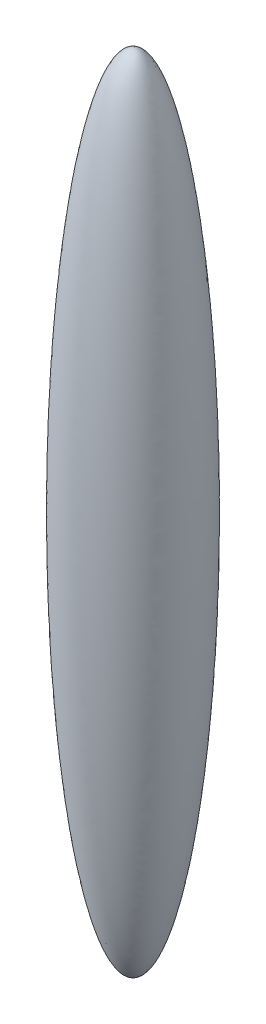
ISO-10303-21;
HEADER;
FILE_DESCRIPTION(('STEP AP214'),'2;1');
FILE_NAME('part.step','',(''),(''),'','','');
FILE_SCHEMA(('AUTOMOTIVE_DESIGN { 1 0 10303 214 1 1 1 1 }'));
ENDSEC;
DATA;
#1=APPLICATION_CONTEXT('core data for automotive mechanical design processes');
#2=APPLICATION_PROTOCOL_DEFINITION('international standard','automotive_design',2000,#1);
#3=PRODUCT_CONTEXT('',#1,'mechanical');
#4=PRODUCT('Part','Part','',(#3));
#5=PRODUCT_RELATED_PRODUCT_CATEGORY('part','',(#4));
#6=PRODUCT_DEFINITION_FORMATION('','',#4);
#7=PRODUCT_DEFINITION_CONTEXT('part definition',#1,'design');
#8=PRODUCT_DEFINITION('design','',#6,#7);
#9=PRODUCT_DEFINITION_SHAPE('','',#8);
#10=(LENGTH_UNIT() NAMED_UNIT(*) SI_UNIT(.MILLI.,.METRE.));
#11=(NAMED_UNIT(*) PLANE_ANGLE_UNIT() SI_UNIT($,.RADIAN.));
#12=(NAMED_UNIT(*) SI_UNIT($,.STERADIAN.) SOLID_ANGLE_UNIT());
#13=UNCERTAINTY_MEASURE_WITH_UNIT(LENGTH_MEASURE(1.E-05),#10,'distance_accuracy_value','');
#14=(GEOMETRIC_REPRESENTATION_CONTEXT(3) GLOBAL_UNCERTAINTY_ASSIGNED_CONTEXT((#13)) GLOBAL_UNIT_ASSIGNED_CONTEXT((#10,
#11,#12)) REPRESENTATION_CONTEXT('',''));
#15=CARTESIAN_POINT('',(0.,0.,0.));
#16=DIRECTION('',(0.,0.,1.));
#17=DIRECTION('',(1.,0.,0.));
#18=AXIS2_PLACEMENT_3D('',#15,#16,#17);
#19=CARTESIAN_POINT('',(0.,500.,0.));
#20=DIRECTION('',(0.,0.,1.));
#21=DIRECTION('',(0.,1.,0.));
#22=AXIS2_PLACEMENT_3D('',#19,#20,#21);
#23=ELLIPSE('',#22,500.,76.2);
#24=TRIMMED_CURVE('',#23,(PARAMETER_VALUE(3.14159265358979)),
(PARAMETER_VALUE(6.28318530717959)),.T.,.PARAMETER.);
#25=CARTESIAN_POINT('',(0.,0.,0.));
#26=DIRECTION('',(0.,-1.,0.));
#27=AXIS1_PLACEMENT('',#25,#26);
#28=SURFACE_OF_REVOLUTION('',#24,#27);
#29=CARTESIAN_POINT('',(0.,1000.,0.));
#30=VERTEX_POINT('',#29);
#31=VERTEX_LOOP('',#30);
#32=FACE_BOUND('',#31,.T.);
#33=CARTESIAN_POINT('',(0.,0.,0.));
#34=VERTEX_POINT('',#33);
#35=VERTEX_LOOP('',#34);
#36=FACE_BOUND('',#35,.T.);
#37=ADVANCED_FACE('F34',(#32,#36),#28,.F.);
#38=CLOSED_SHELL('',(#37));
#39=MANIFOLD_SOLID_BREP('B2',#38);
#40=ADVANCED_BREP_SHAPE_REPRESENTATION('',(#18,#39),#14);
#41=SHAPE_DEFINITION_REPRESENTATION(#9,#40);
ENDSEC;
END-ISO-10303-21;
